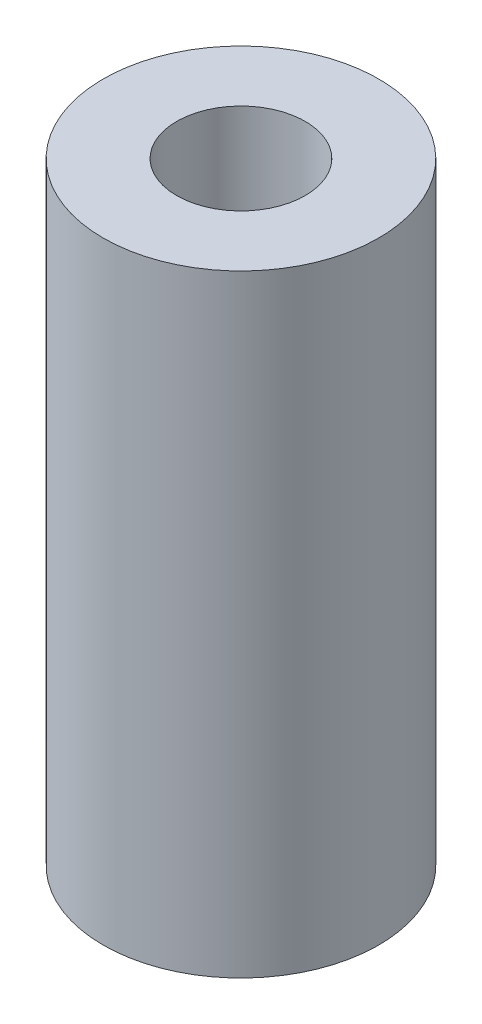
ISO-10303-21;
HEADER;
FILE_DESCRIPTION(('STEP AP214'),'2;1');
FILE_NAME('part.step','',(''),(''),'','','');
FILE_SCHEMA(('AUTOMOTIVE_DESIGN { 1 0 10303 214 1 1 1 1 }'));
ENDSEC;
DATA;
#1=APPLICATION_CONTEXT('core data for automotive mechanical design processes');
#2=APPLICATION_PROTOCOL_DEFINITION('international standard','automotive_design',2000,#1);
#3=PRODUCT_CONTEXT('',#1,'mechanical');
#4=PRODUCT('Part','Part','',(#3));
#5=PRODUCT_RELATED_PRODUCT_CATEGORY('part','',(#4));
#6=PRODUCT_DEFINITION_FORMATION('','',#4);
#7=PRODUCT_DEFINITION_CONTEXT('part definition',#1,'design');
#8=PRODUCT_DEFINITION('design','',#6,#7);
#9=PRODUCT_DEFINITION_SHAPE('','',#8);
#10=(LENGTH_UNIT() NAMED_UNIT(*) SI_UNIT(.MILLI.,.METRE.));
#11=(NAMED_UNIT(*) PLANE_ANGLE_UNIT() SI_UNIT($,.RADIAN.));
#12=(NAMED_UNIT(*) SI_UNIT($,.STERADIAN.) SOLID_ANGLE_UNIT());
#13=UNCERTAINTY_MEASURE_WITH_UNIT(LENGTH_MEASURE(1.E-05),#10,'distance_accuracy_value','');
#14=(GEOMETRIC_REPRESENTATION_CONTEXT(3) GLOBAL_UNCERTAINTY_ASSIGNED_CONTEXT((#13)) GLOBAL_UNIT_ASSIGNED_CONTEXT((#10,
#11,#12)) REPRESENTATION_CONTEXT('',''));
#15=CARTESIAN_POINT('',(0.,0.,0.));
#16=DIRECTION('',(0.,0.,1.));
#17=DIRECTION('',(1.,0.,0.));
#18=AXIS2_PLACEMENT_3D('',#15,#16,#17);
#19=CARTESIAN_POINT('',(0.,12.7,0.));
#20=DIRECTION('',(0.,1.,0.));
#21=DIRECTION('',(0.,0.,1.));
#22=AXIS2_PLACEMENT_3D('',#19,#20,#21);
#23=PLANE('',#22);
#24=CARTESIAN_POINT('',(0.,12.7,0.));
#25=DIRECTION('',(0.,1.,0.));
#26=DIRECTION('',(0.,0.,1.));
#27=AXIS2_PLACEMENT_3D('',#24,#25,#26);
#28=CIRCLE('',#27,5.715);
#29=CARTESIAN_POINT('',(0.,12.7,5.715));
#30=VERTEX_POINT('',#29);
#31=EDGE_CURVE('E10',#30,#30,#28,.T.);
#32=ORIENTED_EDGE('',*,*,#31,.T.);
#33=EDGE_LOOP('',(#32));
#34=FACE_BOUND('',#33,.T.);
#35=CARTESIAN_POINT('',(0.,12.7,0.));
#36=DIRECTION('',(0.,1.,0.));
#37=DIRECTION('',(0.,0.,1.));
#38=AXIS2_PLACEMENT_3D('',#35,#36,#37);
#39=CIRCLE('',#38,2.667);
#40=CARTESIAN_POINT('',(0.,12.7,2.667));
#41=VERTEX_POINT('',#40);
#42=EDGE_CURVE('E44',#41,#41,#39,.T.);
#43=ORIENTED_EDGE('',*,*,#42,.F.);
#44=EDGE_LOOP('',(#43));
#45=FACE_BOUND('',#44,.T.);
#46=ADVANCED_FACE('F33',(#34,#45),#23,.T.);
#47=CARTESIAN_POINT('',(0.,-12.7,0.));
#48=DIRECTION('',(0.,1.,0.));
#49=DIRECTION('',(0.,0.,1.));
#50=AXIS2_PLACEMENT_3D('',#47,#48,#49);
#51=PLANE('',#50);
#52=CARTESIAN_POINT('',(0.,-12.7,0.));
#53=DIRECTION('',(0.,1.,0.));
#54=DIRECTION('',(0.,0.,1.));
#55=AXIS2_PLACEMENT_3D('',#52,#53,#54);
#56=CIRCLE('',#55,5.715);
#57=CARTESIAN_POINT('',(0.,-12.7,5.715));
#58=VERTEX_POINT('',#57);
#59=EDGE_CURVE('E37',#58,#58,#56,.T.);
#60=ORIENTED_EDGE('',*,*,#59,.F.);
#61=EDGE_LOOP('',(#60));
#62=FACE_BOUND('',#61,.T.);
#63=CARTESIAN_POINT('',(0.,-12.7,0.));
#64=DIRECTION('',(0.,1.,0.));
#65=DIRECTION('',(0.,0.,1.));
#66=AXIS2_PLACEMENT_3D('',#63,#64,#65);
#67=CIRCLE('',#66,2.667);
#68=CARTESIAN_POINT('',(0.,-12.7,2.667));
#69=VERTEX_POINT('',#68);
#70=EDGE_CURVE('E46',#69,#69,#67,.T.);
#71=ORIENTED_EDGE('',*,*,#70,.T.);
#72=EDGE_LOOP('',(#71));
#73=FACE_BOUND('',#72,.T.);
#74=ADVANCED_FACE('F56',(#62,#73),#51,.F.);
#75=CARTESIAN_POINT('',(0.,12.7,0.));
#76=DIRECTION('',(0.,-1.,0.));
#77=DIRECTION('',(0.,0.,-1.));
#78=AXIS2_PLACEMENT_3D('',#75,#76,#77);
#79=CYLINDRICAL_SURFACE('',#78,5.715);
#80=ORIENTED_EDGE('',*,*,#31,.F.);
#81=EDGE_LOOP('',(#80));
#82=FACE_BOUND('',#81,.T.);
#83=ORIENTED_EDGE('',*,*,#59,.T.);
#84=EDGE_LOOP('',(#83));
#85=FACE_BOUND('',#84,.T.);
#86=ADVANCED_FACE('F35',(#82,#85),#79,.T.);
#87=CARTESIAN_POINT('',(0.,12.7,0.));
#88=DIRECTION('',(0.,-1.,0.));
#89=DIRECTION('',(0.,0.,-1.));
#90=AXIS2_PLACEMENT_3D('',#87,#88,#89);
#91=CYLINDRICAL_SURFACE('',#90,2.667);
#92=ORIENTED_EDGE('',*,*,#42,.T.);
#93=EDGE_LOOP('',(#92));
#94=FACE_BOUND('',#93,.T.);
#95=ORIENTED_EDGE('',*,*,#70,.F.);
#96=EDGE_LOOP('',(#95));
#97=FACE_BOUND('',#96,.T.);
#98=ADVANCED_FACE('F52',(#94,#97),#91,.F.);
#99=CLOSED_SHELL('',(#46,#74,#86,#98));
#100=MANIFOLD_SOLID_BREP('B2',#99);
#101=ADVANCED_BREP_SHAPE_REPRESENTATION('',(#18,#100),#14);
#102=SHAPE_DEFINITION_REPRESENTATION(#9,#101);
ENDSEC;
END-ISO-10303-21;
